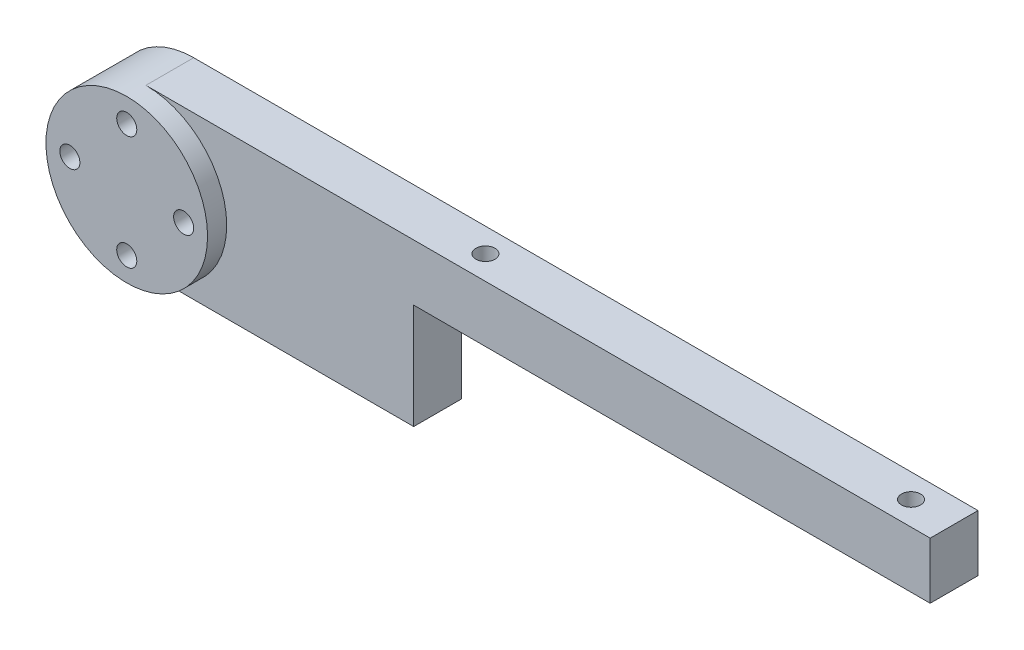
ISO-10303-21;
HEADER;
FILE_DESCRIPTION(('STEP AP214'),'2;1');
FILE_NAME('part.step','',(''),(''),'','','');
FILE_SCHEMA(('AUTOMOTIVE_DESIGN { 1 0 10303 214 1 1 1 1 }'));
ENDSEC;
DATA;
#1=APPLICATION_CONTEXT('core data for automotive mechanical design processes');
#2=APPLICATION_PROTOCOL_DEFINITION('international standard','automotive_design',2000,#1);
#3=PRODUCT_CONTEXT('',#1,'mechanical');
#4=PRODUCT('Part','Part','',(#3));
#5=PRODUCT_RELATED_PRODUCT_CATEGORY('part','',(#4));
#6=PRODUCT_DEFINITION_FORMATION('','',#4);
#7=PRODUCT_DEFINITION_CONTEXT('part definition',#1,'design');
#8=PRODUCT_DEFINITION('design','',#6,#7);
#9=PRODUCT_DEFINITION_SHAPE('','',#8);
#10=(LENGTH_UNIT() NAMED_UNIT(*) SI_UNIT(.MILLI.,.METRE.));
#11=(NAMED_UNIT(*) PLANE_ANGLE_UNIT() SI_UNIT($,.RADIAN.));
#12=(NAMED_UNIT(*) SI_UNIT($,.STERADIAN.) SOLID_ANGLE_UNIT());
#13=UNCERTAINTY_MEASURE_WITH_UNIT(LENGTH_MEASURE(1.E-05),#10,'distance_accuracy_value','');
#14=(GEOMETRIC_REPRESENTATION_CONTEXT(3) GLOBAL_UNCERTAINTY_ASSIGNED_CONTEXT((#13)) GLOBAL_UNIT_ASSIGNED_CONTEXT((#10,
#11,#12)) REPRESENTATION_CONTEXT('',''));
#15=CARTESIAN_POINT('',(0.,0.,0.));
#16=DIRECTION('',(0.,0.,1.));
#17=DIRECTION('',(1.,0.,0.));
#18=AXIS2_PLACEMENT_3D('',#15,#16,#17);
#19=CARTESIAN_POINT('',(0.,0.,2.5));
#20=DIRECTION('',(0.,0.,1.));
#21=DIRECTION('',(1.,0.,0.));
#22=AXIS2_PLACEMENT_3D('',#19,#20,#21);
#23=PLANE('',#22);
#24=CARTESIAN_POINT('',(0.,0.,2.5));
#25=DIRECTION('',(0.,0.,1.));
#26=DIRECTION('',(1.,0.,0.));
#27=AXIS2_PLACEMENT_3D('',#24,#25,#26);
#28=CIRCLE('',#27,8.45);
#29=CARTESIAN_POINT('',(0.,-8.45,2.5));
#30=VERTEX_POINT('',#29);
#31=CARTESIAN_POINT('',(0.,8.45,2.5));
#32=VERTEX_POINT('',#31);
#33=EDGE_CURVE('E11',#30,#32,#28,.T.);
#34=ORIENTED_EDGE('',*,*,#33,.F.);
#35=DIRECTION('',(1.,0.,0.));
#36=VECTOR('',#35,1.);
#37=CARTESIAN_POINT('',(110.,-8.44999999999999,2.5));
#38=LINE('',#37,#36);
#39=CARTESIAN_POINT('',(28.,-8.44999999999999,2.5));
#40=VERTEX_POINT('',#39);
#41=EDGE_CURVE('E103',#30,#40,#38,.T.);
#42=ORIENTED_EDGE('',*,*,#41,.T.);
#43=DIRECTION('',(0.,1.,0.));
#44=VECTOR('',#43,1.);
#45=CARTESIAN_POINT('',(28.,-8.44999999999999,2.5));
#46=LINE('',#45,#44);
#47=CARTESIAN_POINT('',(28.,2.55000000000001,2.5));
#48=VERTEX_POINT('',#47);
#49=EDGE_CURVE('E115',#40,#48,#46,.T.);
#50=ORIENTED_EDGE('',*,*,#49,.T.);
#51=DIRECTION('',(-1.,0.,0.));
#52=VECTOR('',#51,1.);
#53=CARTESIAN_POINT('',(0.,2.55000000000001,2.5));
#54=LINE('',#53,#52);
#55=CARTESIAN_POINT('',(82.,2.55000000000001,2.5));
#56=VERTEX_POINT('',#55);
#57=EDGE_CURVE('E118',#56,#48,#54,.T.);
#58=ORIENTED_EDGE('',*,*,#57,.F.);
#59=DIRECTION('',(0.,-1.,0.));
#60=VECTOR('',#59,1.);
#61=CARTESIAN_POINT('',(82.,8.44999999999999,2.5));
#62=LINE('',#61,#60);
#63=CARTESIAN_POINT('',(82.,8.44999999999999,2.5));
#64=VERTEX_POINT('',#63);
#65=EDGE_CURVE('E102',#64,#56,#62,.T.);
#66=ORIENTED_EDGE('',*,*,#65,.F.);
#67=DIRECTION('',(-1.,0.,0.));
#68=VECTOR('',#67,1.);
#69=CARTESIAN_POINT('',(0.,8.45,2.5));
#70=LINE('',#69,#68);
#71=EDGE_CURVE('E92',#64,#32,#70,.T.);
#72=ORIENTED_EDGE('',*,*,#71,.T.);
#73=EDGE_LOOP('',(#34,#42,#50,#58,#66,#72));
#74=FACE_BOUND('',#73,.T.);
#75=ADVANCED_FACE('F35',(#74),#23,.T.);
#76=CARTESIAN_POINT('',(0.,0.,2.5));
#77=DIRECTION('',(0.,0.,-1.));
#78=DIRECTION('',(-1.,0.,0.));
#79=AXIS2_PLACEMENT_3D('',#76,#77,#78);
#80=CYLINDRICAL_SURFACE('',#79,8.45);
#81=DIRECTION('',(0.,0.,-1.));
#82=VECTOR('',#81,1.);
#83=CARTESIAN_POINT('',(0.,8.45,2.5));
#84=LINE('',#83,#82);
#85=CARTESIAN_POINT('',(0.,8.45,-2.5));
#86=VERTEX_POINT('',#85);
#87=EDGE_CURVE('E89',#32,#86,#84,.T.);
#88=ORIENTED_EDGE('',*,*,#87,.T.);
#89=CARTESIAN_POINT('',(0.,0.,-2.5));
#90=DIRECTION('',(0.,0.,-1.));
#91=DIRECTION('',(-1.,0.,0.));
#92=AXIS2_PLACEMENT_3D('',#89,#90,#91);
#93=CIRCLE('',#92,8.45);
#94=CARTESIAN_POINT('',(0.,-8.45,-2.5));
#95=VERTEX_POINT('',#94);
#96=EDGE_CURVE('E107',#95,#86,#93,.T.);
#97=ORIENTED_EDGE('',*,*,#96,.F.);
#98=DIRECTION('',(0.,0.,-1.));
#99=VECTOR('',#98,1.);
#100=CARTESIAN_POINT('',(0.,-8.45,2.5));
#101=LINE('',#100,#99);
#102=EDGE_CURVE('E98',#30,#95,#101,.T.);
#103=ORIENTED_EDGE('',*,*,#102,.F.);
#104=ORIENTED_EDGE('',*,*,#33,.T.);
#105=EDGE_LOOP('',(#88,#97,#103,#104));
#106=FACE_BOUND('',#105,.T.);
#107=CARTESIAN_POINT('',(0.,0.,4.5));
#108=DIRECTION('',(0.,0.,1.));
#109=DIRECTION('',(1.,0.,0.));
#110=AXIS2_PLACEMENT_3D('',#107,#108,#109);
#111=CIRCLE('',#110,8.45);
#112=CARTESIAN_POINT('',(8.45,0.,4.5));
#113=VERTEX_POINT('',#112);
#114=EDGE_CURVE('E159',#113,#113,#111,.T.);
#115=ORIENTED_EDGE('',*,*,#114,.F.);
#116=EDGE_LOOP('',(#115));
#117=FACE_BOUND('',#116,.T.);
#118=ADVANCED_FACE('F37',(#106,#117),#80,.T.);
#119=CARTESIAN_POINT('',(110.,-8.44999999999999,2.5));
#120=DIRECTION('',(0.,1.,0.));
#121=DIRECTION('',(-1.,0.,0.));
#122=AXIS2_PLACEMENT_3D('',#119,#120,#121);
#123=PLANE('',#122);
#124=ORIENTED_EDGE('',*,*,#102,.T.);
#125=DIRECTION('',(-1.,0.,0.));
#126=VECTOR('',#125,1.);
#127=CARTESIAN_POINT('',(0.,-8.45,-2.5));
#128=LINE('',#127,#126);
#129=CARTESIAN_POINT('',(28.,-8.45,-2.5));
#130=VERTEX_POINT('',#129);
#131=EDGE_CURVE('E131',#130,#95,#128,.T.);
#132=ORIENTED_EDGE('',*,*,#131,.F.);
#133=DIRECTION('',(0.,0.,-1.));
#134=VECTOR('',#133,1.);
#135=CARTESIAN_POINT('',(28.,-8.44999999999999,2.5));
#136=LINE('',#135,#134);
#137=EDGE_CURVE('E113',#40,#130,#136,.T.);
#138=ORIENTED_EDGE('',*,*,#137,.F.);
#139=ORIENTED_EDGE('',*,*,#41,.F.);
#140=EDGE_LOOP('',(#124,#132,#138,#139));
#141=FACE_BOUND('',#140,.T.);
#142=ADVANCED_FACE('F195',(#141),#123,.F.);
#143=CARTESIAN_POINT('',(0.,8.45,2.5));
#144=DIRECTION('',(0.,-1.,0.));
#145=DIRECTION('',(1.,0.,0.));
#146=AXIS2_PLACEMENT_3D('',#143,#144,#145);
#147=PLANE('',#146);
#148=CARTESIAN_POINT('',(77.5,8.44999999999999,0.));
#149=DIRECTION('',(0.,-1.,0.));
#150=DIRECTION('',(1.,0.,0.));
#151=AXIS2_PLACEMENT_3D('',#148,#149,#150);
#152=CIRCLE('',#151,0.999999999999998);
#153=CARTESIAN_POINT('',(78.5,8.44999999999999,0.));
#154=VERTEX_POINT('',#153);
#155=EDGE_CURVE('E150',#154,#154,#152,.T.);
#156=ORIENTED_EDGE('',*,*,#155,.T.);
#157=EDGE_LOOP('',(#156));
#158=FACE_BOUND('',#157,.T.);
#159=CARTESIAN_POINT('',(33.,8.45,0.));
#160=DIRECTION('',(0.,-1.,0.));
#161=DIRECTION('',(1.,0.,0.));
#162=AXIS2_PLACEMENT_3D('',#159,#160,#161);
#163=CIRCLE('',#162,0.999999999999998);
#164=CARTESIAN_POINT('',(34.,8.45,0.));
#165=VERTEX_POINT('',#164);
#166=EDGE_CURVE('E144',#165,#165,#163,.T.);
#167=ORIENTED_EDGE('',*,*,#166,.T.);
#168=EDGE_LOOP('',(#167));
#169=FACE_BOUND('',#168,.T.);
#170=ORIENTED_EDGE('',*,*,#71,.F.);
#171=DIRECTION('',(0.,0.,1.));
#172=VECTOR('',#171,1.);
#173=CARTESIAN_POINT('',(82.,8.44999999999999,-2.5));
#174=LINE('',#173,#172);
#175=CARTESIAN_POINT('',(82.,8.44999999999999,-2.5));
#176=VERTEX_POINT('',#175);
#177=EDGE_CURVE('E158',#176,#64,#174,.T.);
#178=ORIENTED_EDGE('',*,*,#177,.F.);
#179=DIRECTION('',(1.,0.,0.));
#180=VECTOR('',#179,1.);
#181=CARTESIAN_POINT('',(0.,8.45,-2.5));
#182=LINE('',#181,#180);
#183=EDGE_CURVE('E94',#86,#176,#182,.T.);
#184=ORIENTED_EDGE('',*,*,#183,.F.);
#185=ORIENTED_EDGE('',*,*,#87,.F.);
#186=EDGE_LOOP('',(#170,#178,#184,#185));
#187=FACE_BOUND('',#186,.T.);
#188=ADVANCED_FACE('F90',(#158,#169,#187),#147,.F.);
#189=CARTESIAN_POINT('',(-5.95,0.,2.5));
#190=DIRECTION('',(0.,0.,-1.));
#191=DIRECTION('',(-1.,0.,0.));
#192=AXIS2_PLACEMENT_3D('',#189,#190,#191);
#193=CYLINDRICAL_SURFACE('',#192,1.05);
#194=CARTESIAN_POINT('',(-5.95,0.,-2.5));
#195=DIRECTION('',(0.,0.,-1.));
#196=DIRECTION('',(-1.,0.,0.));
#197=AXIS2_PLACEMENT_3D('',#194,#195,#196);
#198=CIRCLE('',#197,1.05);
#199=CARTESIAN_POINT('',(-7.,0.,-2.5));
#200=VERTEX_POINT('',#199);
#201=EDGE_CURVE('E138',#200,#200,#198,.F.);
#202=ORIENTED_EDGE('',*,*,#201,.F.);
#203=EDGE_LOOP('',(#202));
#204=FACE_BOUND('',#203,.T.);
#205=CARTESIAN_POINT('',(-5.95,0.,4.5));
#206=DIRECTION('',(0.,0.,1.));
#207=DIRECTION('',(1.,0.,0.));
#208=AXIS2_PLACEMENT_3D('',#205,#206,#207);
#209=CIRCLE('',#208,1.05);
#210=CARTESIAN_POINT('',(-4.9,0.,4.5));
#211=VERTEX_POINT('',#210);
#212=EDGE_CURVE('E172',#211,#211,#209,.T.);
#213=ORIENTED_EDGE('',*,*,#212,.T.);
#214=EDGE_LOOP('',(#213));
#215=FACE_BOUND('',#214,.T.);
#216=ADVANCED_FACE('F176',(#204,#215),#193,.F.);
#217=CARTESIAN_POINT('',(0.,5.95,2.5));
#218=DIRECTION('',(0.,0.,-1.));
#219=DIRECTION('',(-1.,0.,0.));
#220=AXIS2_PLACEMENT_3D('',#217,#218,#219);
#221=CYLINDRICAL_SURFACE('',#220,1.05);
#222=CARTESIAN_POINT('',(0.,5.95,-2.5));
#223=DIRECTION('',(0.,0.,-1.));
#224=DIRECTION('',(-1.,0.,0.));
#225=AXIS2_PLACEMENT_3D('',#222,#223,#224);
#226=CIRCLE('',#225,1.05);
#227=CARTESIAN_POINT('',(-1.05,5.95,-2.5));
#228=VERTEX_POINT('',#227);
#229=EDGE_CURVE('E126',#228,#228,#226,.F.);
#230=ORIENTED_EDGE('',*,*,#229,.F.);
#231=EDGE_LOOP('',(#230));
#232=FACE_BOUND('',#231,.T.);
#233=CARTESIAN_POINT('',(0.,5.95,4.5));
#234=DIRECTION('',(0.,0.,1.));
#235=DIRECTION('',(1.,0.,0.));
#236=AXIS2_PLACEMENT_3D('',#233,#234,#235);
#237=CIRCLE('',#236,1.05);
#238=CARTESIAN_POINT('',(1.05,5.95,4.5));
#239=VERTEX_POINT('',#238);
#240=EDGE_CURVE('E169',#239,#239,#237,.T.);
#241=ORIENTED_EDGE('',*,*,#240,.T.);
#242=EDGE_LOOP('',(#241));
#243=FACE_BOUND('',#242,.T.);
#244=ADVANCED_FACE('F218',(#232,#243),#221,.F.);
#245=CARTESIAN_POINT('',(5.95,0.,2.5));
#246=DIRECTION('',(0.,0.,-1.));
#247=DIRECTION('',(-1.,0.,0.));
#248=AXIS2_PLACEMENT_3D('',#245,#246,#247);
#249=CYLINDRICAL_SURFACE('',#248,1.05);
#250=CARTESIAN_POINT('',(5.95,0.,-2.5));
#251=DIRECTION('',(0.,0.,-1.));
#252=DIRECTION('',(-1.,0.,0.));
#253=AXIS2_PLACEMENT_3D('',#250,#251,#252);
#254=CIRCLE('',#253,1.05);
#255=CARTESIAN_POINT('',(4.9,0.,-2.5));
#256=VERTEX_POINT('',#255);
#257=EDGE_CURVE('E141',#256,#256,#254,.F.);
#258=ORIENTED_EDGE('',*,*,#257,.F.);
#259=EDGE_LOOP('',(#258));
#260=FACE_BOUND('',#259,.T.);
#261=CARTESIAN_POINT('',(5.95,0.,4.5));
#262=DIRECTION('',(0.,0.,1.));
#263=DIRECTION('',(1.,0.,0.));
#264=AXIS2_PLACEMENT_3D('',#261,#262,#263);
#265=CIRCLE('',#264,1.05);
#266=CARTESIAN_POINT('',(7.,0.,4.5));
#267=VERTEX_POINT('',#266);
#268=EDGE_CURVE('E166',#267,#267,#265,.T.);
#269=ORIENTED_EDGE('',*,*,#268,.T.);
#270=EDGE_LOOP('',(#269));
#271=FACE_BOUND('',#270,.T.);
#272=ADVANCED_FACE('F225',(#260,#271),#249,.F.);
#273=CARTESIAN_POINT('',(0.,-5.95,2.5));
#274=DIRECTION('',(0.,0.,-1.));
#275=DIRECTION('',(-1.,0.,0.));
#276=AXIS2_PLACEMENT_3D('',#273,#274,#275);
#277=CYLINDRICAL_SURFACE('',#276,1.05);
#278=CARTESIAN_POINT('',(0.,-5.95,-2.5));
#279=DIRECTION('',(0.,0.,-1.));
#280=DIRECTION('',(-1.,0.,0.));
#281=AXIS2_PLACEMENT_3D('',#278,#279,#280);
#282=CIRCLE('',#281,1.05);
#283=CARTESIAN_POINT('',(-1.05,-5.95,-2.5));
#284=VERTEX_POINT('',#283);
#285=EDGE_CURVE('E123',#284,#284,#282,.F.);
#286=ORIENTED_EDGE('',*,*,#285,.F.);
#287=EDGE_LOOP('',(#286));
#288=FACE_BOUND('',#287,.T.);
#289=CARTESIAN_POINT('',(0.,-5.95,4.5));
#290=DIRECTION('',(0.,0.,1.));
#291=DIRECTION('',(1.,0.,0.));
#292=AXIS2_PLACEMENT_3D('',#289,#290,#291);
#293=CIRCLE('',#292,1.05);
#294=CARTESIAN_POINT('',(1.05,-5.95,4.5));
#295=VERTEX_POINT('',#294);
#296=EDGE_CURVE('E163',#295,#295,#293,.T.);
#297=ORIENTED_EDGE('',*,*,#296,.T.);
#298=EDGE_LOOP('',(#297));
#299=FACE_BOUND('',#298,.T.);
#300=ADVANCED_FACE('F232',(#288,#299),#277,.F.);
#301=CARTESIAN_POINT('',(28.,-8.44999999999999,2.5));
#302=DIRECTION('',(-1.,0.,0.));
#303=DIRECTION('',(0.,0.,1.));
#304=AXIS2_PLACEMENT_3D('',#301,#302,#303);
#305=PLANE('',#304);
#306=ORIENTED_EDGE('',*,*,#137,.T.);
#307=DIRECTION('',(0.,-1.,0.));
#308=VECTOR('',#307,1.);
#309=CARTESIAN_POINT('',(28.,0.,-2.5));
#310=LINE('',#309,#308);
#311=CARTESIAN_POINT('',(28.,2.55000000000001,-2.5));
#312=VERTEX_POINT('',#311);
#313=EDGE_CURVE('E133',#312,#130,#310,.T.);
#314=ORIENTED_EDGE('',*,*,#313,.F.);
#315=DIRECTION('',(0.,0.,-1.));
#316=VECTOR('',#315,1.);
#317=CARTESIAN_POINT('',(28.,2.55000000000001,9.3));
#318=LINE('',#317,#316);
#319=EDGE_CURVE('E120',#48,#312,#318,.T.);
#320=ORIENTED_EDGE('',*,*,#319,.F.);
#321=ORIENTED_EDGE('',*,*,#49,.F.);
#322=EDGE_LOOP('',(#306,#314,#320,#321));
#323=FACE_BOUND('',#322,.T.);
#324=ADVANCED_FACE('F240',(#323),#305,.F.);
#325=CARTESIAN_POINT('',(28.,2.55000000000001,9.3));
#326=DIRECTION('',(0.,1.,0.));
#327=DIRECTION('',(0.,0.,1.));
#328=AXIS2_PLACEMENT_3D('',#325,#326,#327);
#329=PLANE('',#328);
#330=CARTESIAN_POINT('',(77.5,2.55000000000001,0.));
#331=DIRECTION('',(0.,-1.,0.));
#332=DIRECTION('',(0.,0.,-1.));
#333=AXIS2_PLACEMENT_3D('',#330,#331,#332);
#334=CIRCLE('',#333,0.999999999999998);
#335=CARTESIAN_POINT('',(77.5,2.55000000000001,-0.999999999999998));
#336=VERTEX_POINT('',#335);
#337=EDGE_CURVE('E153',#336,#336,#334,.T.);
#338=ORIENTED_EDGE('',*,*,#337,.F.);
#339=EDGE_LOOP('',(#338));
#340=FACE_BOUND('',#339,.T.);
#341=CARTESIAN_POINT('',(33.,2.55000000000001,0.));
#342=DIRECTION('',(0.,-1.,0.));
#343=DIRECTION('',(0.,0.,-1.));
#344=AXIS2_PLACEMENT_3D('',#341,#342,#343);
#345=CIRCLE('',#344,0.999999999999998);
#346=CARTESIAN_POINT('',(33.,2.55000000000001,-0.999999999999998));
#347=VERTEX_POINT('',#346);
#348=EDGE_CURVE('E147',#347,#347,#345,.T.);
#349=ORIENTED_EDGE('',*,*,#348,.F.);
#350=EDGE_LOOP('',(#349));
#351=FACE_BOUND('',#350,.T.);
#352=DIRECTION('',(-1.,0.,0.));
#353=VECTOR('',#352,1.);
#354=CARTESIAN_POINT('',(0.,2.55000000000001,-2.5));
#355=LINE('',#354,#353);
#356=CARTESIAN_POINT('',(82.,2.55000000000001,-2.5));
#357=VERTEX_POINT('',#356);
#358=EDGE_CURVE('E136',#357,#312,#355,.T.);
#359=ORIENTED_EDGE('',*,*,#358,.F.);
#360=DIRECTION('',(0.,0.,1.));
#361=VECTOR('',#360,1.);
#362=CARTESIAN_POINT('',(82.,2.55000000000001,9.3));
#363=LINE('',#362,#361);
#364=EDGE_CURVE('E51',#357,#56,#363,.T.);
#365=ORIENTED_EDGE('',*,*,#364,.T.);
#366=ORIENTED_EDGE('',*,*,#57,.T.);
#367=ORIENTED_EDGE('',*,*,#319,.T.);
#368=EDGE_LOOP('',(#359,#365,#366,#367));
#369=FACE_BOUND('',#368,.T.);
#370=ADVANCED_FACE('F248',(#340,#351,#369),#329,.F.);
#371=CARTESIAN_POINT('',(0.,0.,-2.5));
#372=DIRECTION('',(0.,0.,-1.));
#373=DIRECTION('',(-1.,0.,0.));
#374=AXIS2_PLACEMENT_3D('',#371,#372,#373);
#375=PLANE('',#374);
#376=DIRECTION('',(0.,1.,0.));
#377=VECTOR('',#376,1.);
#378=CARTESIAN_POINT('',(82.,0.,-2.5));
#379=LINE('',#378,#377);
#380=EDGE_CURVE('E39',#357,#176,#379,.T.);
#381=ORIENTED_EDGE('',*,*,#380,.F.);
#382=ORIENTED_EDGE('',*,*,#358,.T.);
#383=ORIENTED_EDGE('',*,*,#313,.T.);
#384=ORIENTED_EDGE('',*,*,#131,.T.);
#385=ORIENTED_EDGE('',*,*,#96,.T.);
#386=ORIENTED_EDGE('',*,*,#183,.T.);
#387=EDGE_LOOP('',(#381,#382,#383,#384,#385,#386));
#388=FACE_BOUND('',#387,.T.);
#389=ORIENTED_EDGE('',*,*,#257,.T.);
#390=EDGE_LOOP('',(#389));
#391=FACE_BOUND('',#390,.T.);
#392=ORIENTED_EDGE('',*,*,#201,.T.);
#393=EDGE_LOOP('',(#392));
#394=FACE_BOUND('',#393,.T.);
#395=ORIENTED_EDGE('',*,*,#229,.T.);
#396=EDGE_LOOP('',(#395));
#397=FACE_BOUND('',#396,.T.);
#398=ORIENTED_EDGE('',*,*,#285,.T.);
#399=EDGE_LOOP('',(#398));
#400=FACE_BOUND('',#399,.T.);
#401=ADVANCED_FACE('F256',(#388,#391,#394,#397,#400),#375,.T.);
#402=CARTESIAN_POINT('',(33.,12.55,0.));
#403=DIRECTION('',(0.,-1.,0.));
#404=DIRECTION('',(0.,0.,-1.));
#405=AXIS2_PLACEMENT_3D('',#402,#403,#404);
#406=CYLINDRICAL_SURFACE('',#405,0.999999999999998);
#407=ORIENTED_EDGE('',*,*,#348,.T.);
#408=EDGE_LOOP('',(#407));
#409=FACE_BOUND('',#408,.T.);
#410=ORIENTED_EDGE('',*,*,#166,.F.);
#411=EDGE_LOOP('',(#410));
#412=FACE_BOUND('',#411,.T.);
#413=ADVANCED_FACE('F264',(#409,#412),#406,.F.);
#414=CARTESIAN_POINT('',(77.5,12.55,0.));
#415=DIRECTION('',(0.,-1.,0.));
#416=DIRECTION('',(0.,0.,-1.));
#417=AXIS2_PLACEMENT_3D('',#414,#415,#416);
#418=CYLINDRICAL_SURFACE('',#417,0.999999999999998);
#419=ORIENTED_EDGE('',*,*,#337,.T.);
#420=EDGE_LOOP('',(#419));
#421=FACE_BOUND('',#420,.T.);
#422=ORIENTED_EDGE('',*,*,#155,.F.);
#423=EDGE_LOOP('',(#422));
#424=FACE_BOUND('',#423,.T.);
#425=ADVANCED_FACE('F186',(#421,#424),#418,.F.);
#426=CARTESIAN_POINT('',(82.,0.,0.));
#427=DIRECTION('',(-1.,0.,0.));
#428=DIRECTION('',(0.,0.,1.));
#429=AXIS2_PLACEMENT_3D('',#426,#427,#428);
#430=PLANE('',#429);
#431=ORIENTED_EDGE('',*,*,#380,.T.);
#432=ORIENTED_EDGE('',*,*,#177,.T.);
#433=ORIENTED_EDGE('',*,*,#65,.T.);
#434=ORIENTED_EDGE('',*,*,#364,.F.);
#435=EDGE_LOOP('',(#431,#432,#433,#434));
#436=FACE_BOUND('',#435,.T.);
#437=ADVANCED_FACE('F180',(#436),#430,.F.);
#438=CARTESIAN_POINT('',(0.,0.,4.5));
#439=DIRECTION('',(0.,0.,1.));
#440=DIRECTION('',(1.,0.,0.));
#441=AXIS2_PLACEMENT_3D('',#438,#439,#440);
#442=PLANE('',#441);
#443=ORIENTED_EDGE('',*,*,#240,.F.);
#444=EDGE_LOOP('',(#443));
#445=FACE_BOUND('',#444,.T.);
#446=ORIENTED_EDGE('',*,*,#296,.F.);
#447=EDGE_LOOP('',(#446));
#448=FACE_BOUND('',#447,.T.);
#449=ORIENTED_EDGE('',*,*,#114,.T.);
#450=EDGE_LOOP('',(#449));
#451=FACE_BOUND('',#450,.T.);
#452=ORIENTED_EDGE('',*,*,#268,.F.);
#453=EDGE_LOOP('',(#452));
#454=FACE_BOUND('',#453,.T.);
#455=ORIENTED_EDGE('',*,*,#212,.F.);
#456=EDGE_LOOP('',(#455));
#457=FACE_BOUND('',#456,.T.);
#458=ADVANCED_FACE('F178',(#445,#448,#451,#454,#457),#442,.T.);
#459=CLOSED_SHELL('',(#75,#118,#142,#188,#216,#244,#272,#300,#324,#370,#401,#413,#425,#437,#458));
#460=MANIFOLD_SOLID_BREP('B2',#459);
#461=ADVANCED_BREP_SHAPE_REPRESENTATION('',(#18,#460),#14);
#462=SHAPE_DEFINITION_REPRESENTATION(#9,#461);
ENDSEC;
END-ISO-10303-21;
